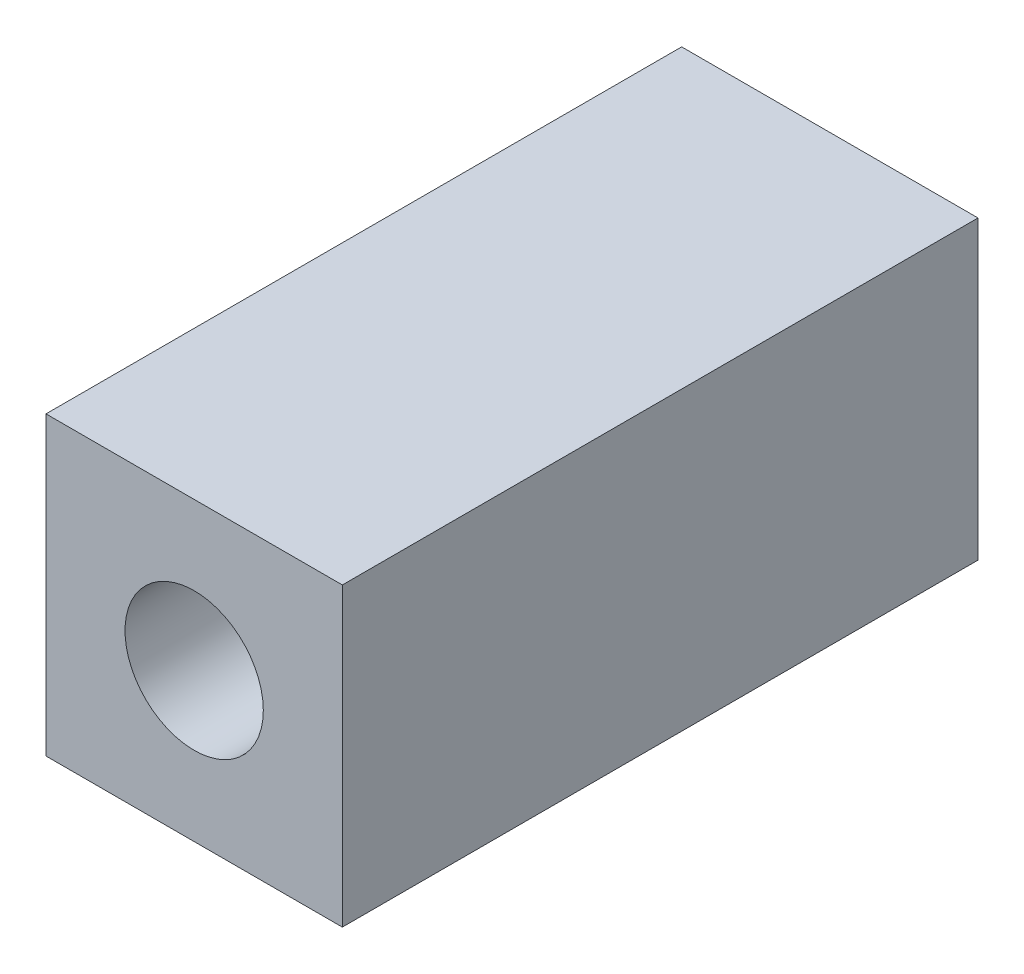
ISO-10303-21;
HEADER;
FILE_DESCRIPTION(('STEP AP214'),'2;1');
FILE_NAME('part.step','',(''),(''),'','','');
FILE_SCHEMA(('AUTOMOTIVE_DESIGN { 1 0 10303 214 1 1 1 1 }'));
ENDSEC;
DATA;
#1=APPLICATION_CONTEXT('core data for automotive mechanical design processes');
#2=APPLICATION_PROTOCOL_DEFINITION('international standard','automotive_design',2000,#1);
#3=PRODUCT_CONTEXT('',#1,'mechanical');
#4=PRODUCT('Part','Part','',(#3));
#5=PRODUCT_RELATED_PRODUCT_CATEGORY('part','',(#4));
#6=PRODUCT_DEFINITION_FORMATION('','',#4);
#7=PRODUCT_DEFINITION_CONTEXT('part definition',#1,'design');
#8=PRODUCT_DEFINITION('design','',#6,#7);
#9=PRODUCT_DEFINITION_SHAPE('','',#8);
#10=(LENGTH_UNIT() NAMED_UNIT(*) SI_UNIT(.MILLI.,.METRE.));
#11=(NAMED_UNIT(*) PLANE_ANGLE_UNIT() SI_UNIT($,.RADIAN.));
#12=(NAMED_UNIT(*) SI_UNIT($,.STERADIAN.) SOLID_ANGLE_UNIT());
#13=UNCERTAINTY_MEASURE_WITH_UNIT(LENGTH_MEASURE(1.E-05),#10,'distance_accuracy_value','');
#14=(GEOMETRIC_REPRESENTATION_CONTEXT(3) GLOBAL_UNCERTAINTY_ASSIGNED_CONTEXT((#13)) GLOBAL_UNIT_ASSIGNED_CONTEXT((#10,
#11,#12)) REPRESENTATION_CONTEXT('',''));
#15=CARTESIAN_POINT('',(0.,0.,0.));
#16=DIRECTION('',(0.,0.,1.));
#17=DIRECTION('',(1.,0.,0.));
#18=AXIS2_PLACEMENT_3D('',#15,#16,#17);
#19=CARTESIAN_POINT('',(0.,0.,12.87));
#20=DIRECTION('',(0.,0.,-1.));
#21=DIRECTION('',(-1.,0.,0.));
#22=AXIS2_PLACEMENT_3D('',#19,#20,#21);
#23=PLANE('',#22);
#24=DIRECTION('',(0.,-1.,0.));
#25=VECTOR('',#24,1.);
#26=CARTESIAN_POINT('',(-3.,3.,12.87));
#27=LINE('',#26,#25);
#28=CARTESIAN_POINT('',(-3.,3.,12.87));
#29=VERTEX_POINT('',#28);
#30=CARTESIAN_POINT('',(-3.,-3.,12.87));
#31=VERTEX_POINT('',#30);
#32=EDGE_CURVE('E89',#29,#31,#27,.T.);
#33=ORIENTED_EDGE('',*,*,#32,.T.);
#34=DIRECTION('',(1.,0.,0.));
#35=VECTOR('',#34,1.);
#36=CARTESIAN_POINT('',(3.,-3.,12.87));
#37=LINE('',#36,#35);
#38=CARTESIAN_POINT('',(3.,-3.,12.87));
#39=VERTEX_POINT('',#38);
#40=EDGE_CURVE('E84',#31,#39,#37,.T.);
#41=ORIENTED_EDGE('',*,*,#40,.T.);
#42=DIRECTION('',(0.,1.,0.));
#43=VECTOR('',#42,1.);
#44=CARTESIAN_POINT('',(3.,3.,12.87));
#45=LINE('',#44,#43);
#46=CARTESIAN_POINT('',(3.,3.,12.87));
#47=VERTEX_POINT('',#46);
#48=EDGE_CURVE('E87',#39,#47,#45,.T.);
#49=ORIENTED_EDGE('',*,*,#48,.T.);
#50=DIRECTION('',(-1.,0.,0.));
#51=VECTOR('',#50,1.);
#52=CARTESIAN_POINT('',(3.,3.,12.87));
#53=LINE('',#52,#51);
#54=EDGE_CURVE('E54',#47,#29,#53,.T.);
#55=ORIENTED_EDGE('',*,*,#54,.T.);
#56=EDGE_LOOP('',(#33,#41,#49,#55));
#57=FACE_BOUND('',#56,.T.);
#58=CARTESIAN_POINT('',(0.,0.,12.87));
#59=DIRECTION('',(0.,0.,1.));
#60=DIRECTION('',(1.,0.,0.));
#61=AXIS2_PLACEMENT_3D('',#58,#59,#60);
#62=CIRCLE('',#61,1.4);
#63=CARTESIAN_POINT('',(1.4,0.,12.87));
#64=VERTEX_POINT('',#63);
#65=EDGE_CURVE('E104',#64,#64,#62,.T.);
#66=ORIENTED_EDGE('',*,*,#65,.F.);
#67=EDGE_LOOP('',(#66));
#68=FACE_BOUND('',#67,.T.);
#69=ADVANCED_FACE('F37',(#57,#68),#23,.F.);
#70=CARTESIAN_POINT('',(0.,0.,0.));
#71=DIRECTION('',(0.,0.,-1.));
#72=DIRECTION('',(-1.,0.,0.));
#73=AXIS2_PLACEMENT_3D('',#70,#71,#72);
#74=PLANE('',#73);
#75=DIRECTION('',(0.,-1.,0.));
#76=VECTOR('',#75,1.);
#77=CARTESIAN_POINT('',(-3.,3.,0.));
#78=LINE('',#77,#76);
#79=CARTESIAN_POINT('',(-3.,3.,0.));
#80=VERTEX_POINT('',#79);
#81=CARTESIAN_POINT('',(-3.,-3.,0.));
#82=VERTEX_POINT('',#81);
#83=EDGE_CURVE('E101',#80,#82,#78,.T.);
#84=ORIENTED_EDGE('',*,*,#83,.F.);
#85=DIRECTION('',(-1.,0.,0.));
#86=VECTOR('',#85,1.);
#87=CARTESIAN_POINT('',(3.,3.,0.));
#88=LINE('',#87,#86);
#89=CARTESIAN_POINT('',(3.,3.,0.));
#90=VERTEX_POINT('',#89);
#91=EDGE_CURVE('E77',#90,#80,#88,.T.);
#92=ORIENTED_EDGE('',*,*,#91,.F.);
#93=DIRECTION('',(0.,1.,0.));
#94=VECTOR('',#93,1.);
#95=CARTESIAN_POINT('',(3.,3.,0.));
#96=LINE('',#95,#94);
#97=CARTESIAN_POINT('',(3.,-3.,0.));
#98=VERTEX_POINT('',#97);
#99=EDGE_CURVE('E71',#98,#90,#96,.T.);
#100=ORIENTED_EDGE('',*,*,#99,.F.);
#101=DIRECTION('',(1.,0.,0.));
#102=VECTOR('',#101,1.);
#103=CARTESIAN_POINT('',(3.,-3.,0.));
#104=LINE('',#103,#102);
#105=EDGE_CURVE('E93',#82,#98,#104,.T.);
#106=ORIENTED_EDGE('',*,*,#105,.F.);
#107=EDGE_LOOP('',(#84,#92,#100,#106));
#108=FACE_BOUND('',#107,.T.);
#109=CARTESIAN_POINT('',(0.,0.,0.));
#110=DIRECTION('',(0.,0.,1.));
#111=DIRECTION('',(1.,0.,0.));
#112=AXIS2_PLACEMENT_3D('',#109,#110,#111);
#113=CIRCLE('',#112,1.4);
#114=CARTESIAN_POINT('',(1.4,0.,0.));
#115=VERTEX_POINT('',#114);
#116=EDGE_CURVE('E116',#115,#115,#113,.T.);
#117=ORIENTED_EDGE('',*,*,#116,.T.);
#118=EDGE_LOOP('',(#117));
#119=FACE_BOUND('',#118,.T.);
#120=ADVANCED_FACE('F112',(#108,#119),#74,.T.);
#121=CARTESIAN_POINT('',(-3.,3.,12.87));
#122=DIRECTION('',(1.,0.,0.));
#123=DIRECTION('',(0.,1.,0.));
#124=AXIS2_PLACEMENT_3D('',#121,#122,#123);
#125=PLANE('',#124);
#126=ORIENTED_EDGE('',*,*,#83,.T.);
#127=DIRECTION('',(0.,0.,-1.));
#128=VECTOR('',#127,1.);
#129=CARTESIAN_POINT('',(-3.,-3.,12.87));
#130=LINE('',#129,#128);
#131=EDGE_CURVE('E11',#31,#82,#130,.T.);
#132=ORIENTED_EDGE('',*,*,#131,.F.);
#133=ORIENTED_EDGE('',*,*,#32,.F.);
#134=DIRECTION('',(0.,0.,-1.));
#135=VECTOR('',#134,1.);
#136=CARTESIAN_POINT('',(-3.,3.,12.87));
#137=LINE('',#136,#135);
#138=EDGE_CURVE('E97',#29,#80,#137,.T.);
#139=ORIENTED_EDGE('',*,*,#138,.T.);
#140=EDGE_LOOP('',(#126,#132,#133,#139));
#141=FACE_BOUND('',#140,.T.);
#142=ADVANCED_FACE('F39',(#141),#125,.F.);
#143=CARTESIAN_POINT('',(3.,-3.,12.87));
#144=DIRECTION('',(0.,1.,0.));
#145=DIRECTION('',(-1.,0.,0.));
#146=AXIS2_PLACEMENT_3D('',#143,#144,#145);
#147=PLANE('',#146);
#148=ORIENTED_EDGE('',*,*,#105,.T.);
#149=DIRECTION('',(0.,0.,-1.));
#150=VECTOR('',#149,1.);
#151=CARTESIAN_POINT('',(3.,-3.,12.87));
#152=LINE('',#151,#150);
#153=EDGE_CURVE('E46',#39,#98,#152,.T.);
#154=ORIENTED_EDGE('',*,*,#153,.F.);
#155=ORIENTED_EDGE('',*,*,#40,.F.);
#156=ORIENTED_EDGE('',*,*,#131,.T.);
#157=EDGE_LOOP('',(#148,#154,#155,#156));
#158=FACE_BOUND('',#157,.T.);
#159=ADVANCED_FACE('F92',(#158),#147,.F.);
#160=CARTESIAN_POINT('',(3.,3.,12.87));
#161=DIRECTION('',(-1.,0.,0.));
#162=DIRECTION('',(0.,-1.,0.));
#163=AXIS2_PLACEMENT_3D('',#160,#161,#162);
#164=PLANE('',#163);
#165=ORIENTED_EDGE('',*,*,#99,.T.);
#166=DIRECTION('',(0.,0.,-1.));
#167=VECTOR('',#166,1.);
#168=CARTESIAN_POINT('',(3.,3.,12.87));
#169=LINE('',#168,#167);
#170=EDGE_CURVE('E94',#47,#90,#169,.T.);
#171=ORIENTED_EDGE('',*,*,#170,.F.);
#172=ORIENTED_EDGE('',*,*,#48,.F.);
#173=ORIENTED_EDGE('',*,*,#153,.T.);
#174=EDGE_LOOP('',(#165,#171,#172,#173));
#175=FACE_BOUND('',#174,.T.);
#176=ADVANCED_FACE('F95',(#175),#164,.F.);
#177=CARTESIAN_POINT('',(3.,3.,12.87));
#178=DIRECTION('',(0.,-1.,0.));
#179=DIRECTION('',(1.,0.,0.));
#180=AXIS2_PLACEMENT_3D('',#177,#178,#179);
#181=PLANE('',#180);
#182=ORIENTED_EDGE('',*,*,#91,.T.);
#183=ORIENTED_EDGE('',*,*,#138,.F.);
#184=ORIENTED_EDGE('',*,*,#54,.F.);
#185=ORIENTED_EDGE('',*,*,#170,.T.);
#186=EDGE_LOOP('',(#182,#183,#184,#185));
#187=FACE_BOUND('',#186,.T.);
#188=ADVANCED_FACE('F109',(#187),#181,.F.);
#189=CARTESIAN_POINT('',(0.,0.,12.87));
#190=DIRECTION('',(0.,0.,-1.));
#191=DIRECTION('',(-1.,0.,0.));
#192=AXIS2_PLACEMENT_3D('',#189,#190,#191);
#193=CYLINDRICAL_SURFACE('',#192,1.4);
#194=ORIENTED_EDGE('',*,*,#65,.T.);
#195=EDGE_LOOP('',(#194));
#196=FACE_BOUND('',#195,.T.);
#197=ORIENTED_EDGE('',*,*,#116,.F.);
#198=EDGE_LOOP('',(#197));
#199=FACE_BOUND('',#198,.T.);
#200=ADVANCED_FACE('F122',(#196,#199),#193,.F.);
#201=CLOSED_SHELL('',(#69,#120,#142,#159,#176,#188,#200));
#202=MANIFOLD_SOLID_BREP('B2',#201);
#203=ADVANCED_BREP_SHAPE_REPRESENTATION('',(#18,#202),#14);
#204=SHAPE_DEFINITION_REPRESENTATION(#9,#203);
ENDSEC;
END-ISO-10303-21;
